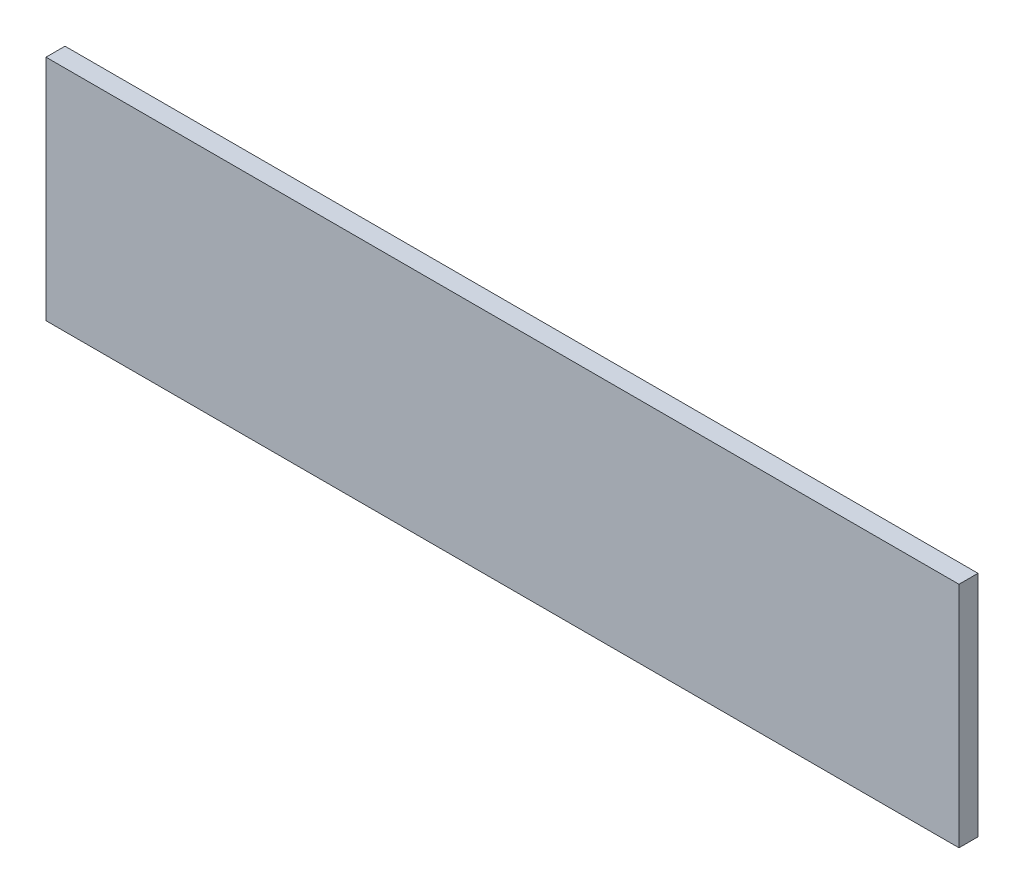
ISO-10303-21;
HEADER;
FILE_DESCRIPTION(('STEP AP214'),'2;1');
FILE_NAME('part.step','',(''),(''),'','','');
FILE_SCHEMA(('AUTOMOTIVE_DESIGN { 1 0 10303 214 1 1 1 1 }'));
ENDSEC;
DATA;
#1=APPLICATION_CONTEXT('core data for automotive mechanical design processes');
#2=APPLICATION_PROTOCOL_DEFINITION('international standard','automotive_design',2000,#1);
#3=PRODUCT_CONTEXT('',#1,'mechanical');
#4=PRODUCT('Part','Part','',(#3));
#5=PRODUCT_RELATED_PRODUCT_CATEGORY('part','',(#4));
#6=PRODUCT_DEFINITION_FORMATION('','',#4);
#7=PRODUCT_DEFINITION_CONTEXT('part definition',#1,'design');
#8=PRODUCT_DEFINITION('design','',#6,#7);
#9=PRODUCT_DEFINITION_SHAPE('','',#8);
#10=(LENGTH_UNIT() NAMED_UNIT(*) SI_UNIT(.MILLI.,.METRE.));
#11=(NAMED_UNIT(*) PLANE_ANGLE_UNIT() SI_UNIT($,.RADIAN.));
#12=(NAMED_UNIT(*) SI_UNIT($,.STERADIAN.) SOLID_ANGLE_UNIT());
#13=UNCERTAINTY_MEASURE_WITH_UNIT(LENGTH_MEASURE(1.E-05),#10,'distance_accuracy_value','');
#14=(GEOMETRIC_REPRESENTATION_CONTEXT(3) GLOBAL_UNCERTAINTY_ASSIGNED_CONTEXT((#13)) GLOBAL_UNIT_ASSIGNED_CONTEXT((#10,
#11,#12)) REPRESENTATION_CONTEXT('',''));
#15=CARTESIAN_POINT('',(0.,0.,0.));
#16=DIRECTION('',(0.,0.,1.));
#17=DIRECTION('',(1.,0.,0.));
#18=AXIS2_PLACEMENT_3D('',#15,#16,#17);
#19=CARTESIAN_POINT('',(1219.2,-304.8,-25.4));
#20=DIRECTION('',(0.,-1.,0.));
#21=DIRECTION('',(1.,0.,0.));
#22=AXIS2_PLACEMENT_3D('',#19,#20,#21);
#23=PLANE('',#22);
#24=DIRECTION('',(0.,0.,1.));
#25=VECTOR('',#24,1.);
#26=CARTESIAN_POINT('',(1219.2,-304.8,-25.4));
#27=LINE('',#26,#25);
#28=CARTESIAN_POINT('',(1219.2,-304.8,-25.4));
#29=VERTEX_POINT('',#28);
#30=CARTESIAN_POINT('',(1219.2,-304.8,25.4));
#31=VERTEX_POINT('',#30);
#32=EDGE_CURVE('E35',#29,#31,#27,.T.);
#33=ORIENTED_EDGE('',*,*,#32,.T.);
#34=DIRECTION('',(1.,0.,0.));
#35=VECTOR('',#34,1.);
#36=CARTESIAN_POINT('',(1219.2,-304.8,25.4));
#37=LINE('',#36,#35);
#38=CARTESIAN_POINT('',(-1219.2,-304.8,25.4));
#39=VERTEX_POINT('',#38);
#40=EDGE_CURVE('E72',#39,#31,#37,.T.);
#41=ORIENTED_EDGE('',*,*,#40,.F.);
#42=DIRECTION('',(0.,0.,1.));
#43=VECTOR('',#42,1.);
#44=CARTESIAN_POINT('',(-1219.2,-304.8,-25.4));
#45=LINE('',#44,#43);
#46=CARTESIAN_POINT('',(-1219.2,-304.8,-25.4));
#47=VERTEX_POINT('',#46);
#48=EDGE_CURVE('E11',#47,#39,#45,.T.);
#49=ORIENTED_EDGE('',*,*,#48,.F.);
#50=DIRECTION('',(1.,0.,0.));
#51=VECTOR('',#50,1.);
#52=CARTESIAN_POINT('',(1219.2,-304.8,-25.4));
#53=LINE('',#52,#51);
#54=EDGE_CURVE('E73',#47,#29,#53,.T.);
#55=ORIENTED_EDGE('',*,*,#54,.T.);
#56=EDGE_LOOP('',(#33,#41,#49,#55));
#57=FACE_BOUND('',#56,.T.);
#58=ADVANCED_FACE('F32',(#57),#23,.T.);
#59=CARTESIAN_POINT('',(-1219.2,-304.8,-25.4));
#60=DIRECTION('',(-1.,0.,0.));
#61=DIRECTION('',(0.,0.,1.));
#62=AXIS2_PLACEMENT_3D('',#59,#60,#61);
#63=PLANE('',#62);
#64=ORIENTED_EDGE('',*,*,#48,.T.);
#65=DIRECTION('',(0.,-1.,0.));
#66=VECTOR('',#65,1.);
#67=CARTESIAN_POINT('',(-1219.2,-304.8,25.4));
#68=LINE('',#67,#66);
#69=CARTESIAN_POINT('',(-1219.2,304.8,25.4));
#70=VERTEX_POINT('',#69);
#71=EDGE_CURVE('E89',#70,#39,#68,.T.);
#72=ORIENTED_EDGE('',*,*,#71,.F.);
#73=DIRECTION('',(0.,0.,1.));
#74=VECTOR('',#73,1.);
#75=CARTESIAN_POINT('',(-1219.2,304.8,-25.4));
#76=LINE('',#75,#74);
#77=CARTESIAN_POINT('',(-1219.2,304.8,-25.4));
#78=VERTEX_POINT('',#77);
#79=EDGE_CURVE('E40',#78,#70,#76,.T.);
#80=ORIENTED_EDGE('',*,*,#79,.F.);
#81=DIRECTION('',(0.,-1.,0.));
#82=VECTOR('',#81,1.);
#83=CARTESIAN_POINT('',(-1219.2,-304.8,-25.4));
#84=LINE('',#83,#82);
#85=EDGE_CURVE('E78',#78,#47,#84,.T.);
#86=ORIENTED_EDGE('',*,*,#85,.T.);
#87=EDGE_LOOP('',(#64,#72,#80,#86));
#88=FACE_BOUND('',#87,.T.);
#89=ADVANCED_FACE('F104',(#88),#63,.T.);
#90=CARTESIAN_POINT('',(1219.2,304.8,-25.4));
#91=DIRECTION('',(0.,1.,0.));
#92=DIRECTION('',(-1.,0.,0.));
#93=AXIS2_PLACEMENT_3D('',#90,#91,#92);
#94=PLANE('',#93);
#95=ORIENTED_EDGE('',*,*,#79,.T.);
#96=DIRECTION('',(-1.,0.,0.));
#97=VECTOR('',#96,1.);
#98=CARTESIAN_POINT('',(1219.2,304.8,25.4));
#99=LINE('',#98,#97);
#100=CARTESIAN_POINT('',(1219.2,304.8,25.4));
#101=VERTEX_POINT('',#100);
#102=EDGE_CURVE('E85',#101,#70,#99,.T.);
#103=ORIENTED_EDGE('',*,*,#102,.F.);
#104=DIRECTION('',(0.,0.,1.));
#105=VECTOR('',#104,1.);
#106=CARTESIAN_POINT('',(1219.2,304.8,-25.4));
#107=LINE('',#106,#105);
#108=CARTESIAN_POINT('',(1219.2,304.8,-25.4));
#109=VERTEX_POINT('',#108);
#110=EDGE_CURVE('E77',#109,#101,#107,.T.);
#111=ORIENTED_EDGE('',*,*,#110,.F.);
#112=DIRECTION('',(-1.,0.,0.));
#113=VECTOR('',#112,1.);
#114=CARTESIAN_POINT('',(1219.2,304.8,-25.4));
#115=LINE('',#114,#113);
#116=EDGE_CURVE('E97',#109,#78,#115,.T.);
#117=ORIENTED_EDGE('',*,*,#116,.T.);
#118=EDGE_LOOP('',(#95,#103,#111,#117));
#119=FACE_BOUND('',#118,.T.);
#120=ADVANCED_FACE('F101',(#119),#94,.T.);
#121=CARTESIAN_POINT('',(1219.2,-304.8,-25.4));
#122=DIRECTION('',(1.,0.,0.));
#123=DIRECTION('',(0.,0.,-1.));
#124=AXIS2_PLACEMENT_3D('',#121,#122,#123);
#125=PLANE('',#124);
#126=ORIENTED_EDGE('',*,*,#110,.T.);
#127=DIRECTION('',(0.,1.,0.));
#128=VECTOR('',#127,1.);
#129=CARTESIAN_POINT('',(1219.2,-304.8,25.4));
#130=LINE('',#129,#128);
#131=EDGE_CURVE('E80',#31,#101,#130,.T.);
#132=ORIENTED_EDGE('',*,*,#131,.F.);
#133=ORIENTED_EDGE('',*,*,#32,.F.);
#134=DIRECTION('',(0.,1.,0.));
#135=VECTOR('',#134,1.);
#136=CARTESIAN_POINT('',(1219.2,-304.8,-25.4));
#137=LINE('',#136,#135);
#138=EDGE_CURVE('E95',#29,#109,#137,.T.);
#139=ORIENTED_EDGE('',*,*,#138,.T.);
#140=EDGE_LOOP('',(#126,#132,#133,#139));
#141=FACE_BOUND('',#140,.T.);
#142=ADVANCED_FACE('F81',(#141),#125,.T.);
#143=CARTESIAN_POINT('',(0.,0.,-25.4));
#144=DIRECTION('',(0.,0.,-1.));
#145=DIRECTION('',(-1.,0.,0.));
#146=AXIS2_PLACEMENT_3D('',#143,#144,#145);
#147=PLANE('',#146);
#148=ORIENTED_EDGE('',*,*,#54,.F.);
#149=ORIENTED_EDGE('',*,*,#85,.F.);
#150=ORIENTED_EDGE('',*,*,#116,.F.);
#151=ORIENTED_EDGE('',*,*,#138,.F.);
#152=EDGE_LOOP('',(#148,#149,#150,#151));
#153=FACE_BOUND('',#152,.T.);
#154=ADVANCED_FACE('F106',(#153),#147,.T.);
#155=CARTESIAN_POINT('',(0.,0.,25.4));
#156=DIRECTION('',(0.,0.,-1.));
#157=DIRECTION('',(-1.,0.,0.));
#158=AXIS2_PLACEMENT_3D('',#155,#156,#157);
#159=PLANE('',#158);
#160=ORIENTED_EDGE('',*,*,#40,.T.);
#161=ORIENTED_EDGE('',*,*,#131,.T.);
#162=ORIENTED_EDGE('',*,*,#102,.T.);
#163=ORIENTED_EDGE('',*,*,#71,.T.);
#164=EDGE_LOOP('',(#160,#161,#162,#163));
#165=FACE_BOUND('',#164,.T.);
#166=ADVANCED_FACE('F88',(#165),#159,.F.);
#167=CLOSED_SHELL('',(#58,#89,#120,#142,#154,#166));
#168=MANIFOLD_SOLID_BREP('B2',#167);
#169=ADVANCED_BREP_SHAPE_REPRESENTATION('',(#18,#168),#14);
#170=SHAPE_DEFINITION_REPRESENTATION(#9,#169);
ENDSEC;
END-ISO-10303-21;
